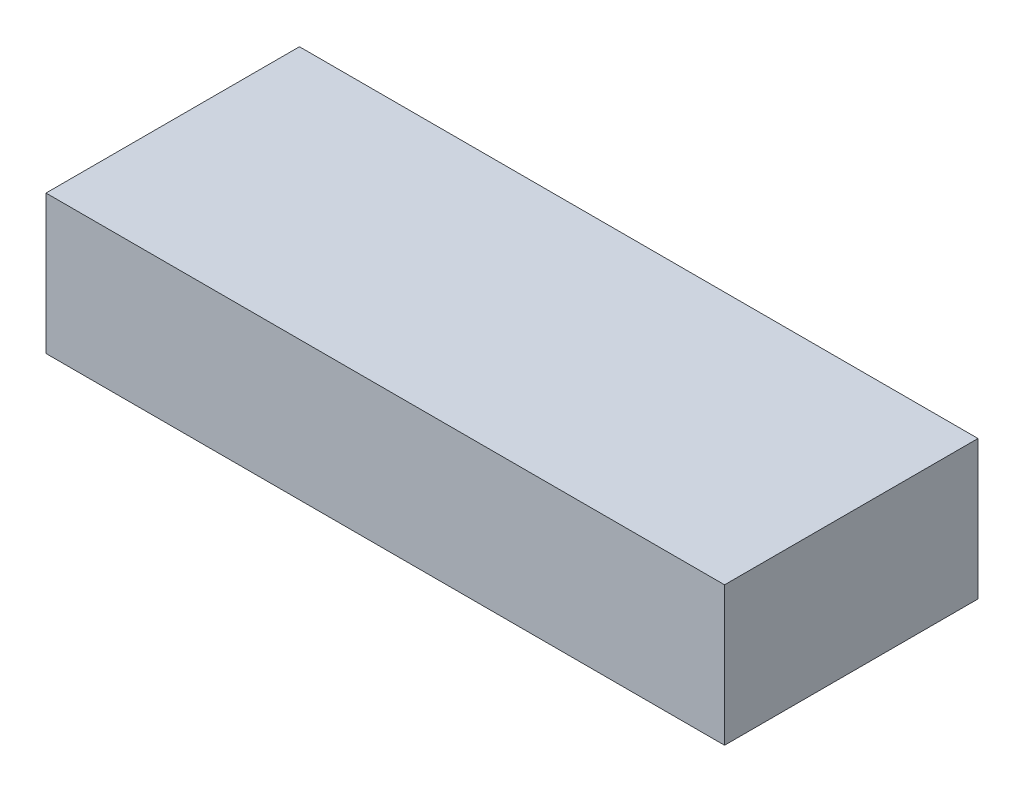
ISO-10303-21;
HEADER;
FILE_DESCRIPTION(('STEP AP214'),'2;1');
FILE_NAME('part.step','',(''),(''),'','','');
FILE_SCHEMA(('AUTOMOTIVE_DESIGN { 1 0 10303 214 1 1 1 1 }'));
ENDSEC;
DATA;
#1=APPLICATION_CONTEXT('core data for automotive mechanical design processes');
#2=APPLICATION_PROTOCOL_DEFINITION('international standard','automotive_design',2000,#1);
#3=PRODUCT_CONTEXT('',#1,'mechanical');
#4=PRODUCT('Part','Part','',(#3));
#5=PRODUCT_RELATED_PRODUCT_CATEGORY('part','',(#4));
#6=PRODUCT_DEFINITION_FORMATION('','',#4);
#7=PRODUCT_DEFINITION_CONTEXT('part definition',#1,'design');
#8=PRODUCT_DEFINITION('design','',#6,#7);
#9=PRODUCT_DEFINITION_SHAPE('','',#8);
#10=(LENGTH_UNIT() NAMED_UNIT(*) SI_UNIT(.MILLI.,.METRE.));
#11=(NAMED_UNIT(*) PLANE_ANGLE_UNIT() SI_UNIT($,.RADIAN.));
#12=(NAMED_UNIT(*) SI_UNIT($,.STERADIAN.) SOLID_ANGLE_UNIT());
#13=UNCERTAINTY_MEASURE_WITH_UNIT(LENGTH_MEASURE(1.E-05),#10,'distance_accuracy_value','');
#14=(GEOMETRIC_REPRESENTATION_CONTEXT(3) GLOBAL_UNCERTAINTY_ASSIGNED_CONTEXT((#13)) GLOBAL_UNIT_ASSIGNED_CONTEXT((#10,
#11,#12)) REPRESENTATION_CONTEXT('',''));
#15=CARTESIAN_POINT('',(0.,0.,0.));
#16=DIRECTION('',(0.,0.,1.));
#17=DIRECTION('',(1.,0.,0.));
#18=AXIS2_PLACEMENT_3D('',#15,#16,#17);
#19=CARTESIAN_POINT('',(0.,17.,31.));
#20=DIRECTION('',(1.,0.,0.));
#21=DIRECTION('',(0.,0.,-1.));
#22=AXIS2_PLACEMENT_3D('',#19,#20,#21);
#23=PLANE('',#22);
#24=DIRECTION('',(0.,-1.,0.));
#25=VECTOR('',#24,1.);
#26=CARTESIAN_POINT('',(0.,17.,0.));
#27=LINE('',#26,#25);
#28=CARTESIAN_POINT('',(0.,17.,0.));
#29=VERTEX_POINT('',#28);
#30=CARTESIAN_POINT('',(0.,0.,0.));
#31=VERTEX_POINT('',#30);
#32=EDGE_CURVE('E94',#29,#31,#27,.T.);
#33=ORIENTED_EDGE('',*,*,#32,.T.);
#34=DIRECTION('',(0.,0.,-1.));
#35=VECTOR('',#34,1.);
#36=CARTESIAN_POINT('',(0.,0.,31.));
#37=LINE('',#36,#35);
#38=CARTESIAN_POINT('',(0.,0.,31.));
#39=VERTEX_POINT('',#38);
#40=EDGE_CURVE('E11',#39,#31,#37,.T.);
#41=ORIENTED_EDGE('',*,*,#40,.F.);
#42=DIRECTION('',(0.,-1.,0.));
#43=VECTOR('',#42,1.);
#44=CARTESIAN_POINT('',(0.,17.,31.));
#45=LINE('',#44,#43);
#46=CARTESIAN_POINT('',(0.,17.,31.));
#47=VERTEX_POINT('',#46);
#48=EDGE_CURVE('E82',#47,#39,#45,.T.);
#49=ORIENTED_EDGE('',*,*,#48,.F.);
#50=DIRECTION('',(0.,0.,-1.));
#51=VECTOR('',#50,1.);
#52=CARTESIAN_POINT('',(0.,17.,31.));
#53=LINE('',#52,#51);
#54=EDGE_CURVE('E90',#47,#29,#53,.T.);
#55=ORIENTED_EDGE('',*,*,#54,.T.);
#56=EDGE_LOOP('',(#33,#41,#49,#55));
#57=FACE_BOUND('',#56,.T.);
#58=ADVANCED_FACE('F31',(#57),#23,.F.);
#59=CARTESIAN_POINT('',(0.,0.,31.));
#60=DIRECTION('',(0.,1.,0.));
#61=DIRECTION('',(0.,0.,1.));
#62=AXIS2_PLACEMENT_3D('',#59,#60,#61);
#63=PLANE('',#62);
#64=DIRECTION('',(1.,0.,0.));
#65=VECTOR('',#64,1.);
#66=CARTESIAN_POINT('',(0.,0.,0.));
#67=LINE('',#66,#65);
#68=CARTESIAN_POINT('',(83.,0.,0.));
#69=VERTEX_POINT('',#68);
#70=EDGE_CURVE('E86',#31,#69,#67,.T.);
#71=ORIENTED_EDGE('',*,*,#70,.T.);
#72=DIRECTION('',(0.,0.,-1.));
#73=VECTOR('',#72,1.);
#74=CARTESIAN_POINT('',(83.,0.,31.));
#75=LINE('',#74,#73);
#76=CARTESIAN_POINT('',(83.,0.,31.));
#77=VERTEX_POINT('',#76);
#78=EDGE_CURVE('E39',#77,#69,#75,.T.);
#79=ORIENTED_EDGE('',*,*,#78,.F.);
#80=DIRECTION('',(1.,0.,0.));
#81=VECTOR('',#80,1.);
#82=CARTESIAN_POINT('',(0.,0.,31.));
#83=LINE('',#82,#81);
#84=EDGE_CURVE('E77',#39,#77,#83,.T.);
#85=ORIENTED_EDGE('',*,*,#84,.F.);
#86=ORIENTED_EDGE('',*,*,#40,.T.);
#87=EDGE_LOOP('',(#71,#79,#85,#86));
#88=FACE_BOUND('',#87,.T.);
#89=ADVANCED_FACE('F85',(#88),#63,.F.);
#90=CARTESIAN_POINT('',(83.,0.,31.));
#91=DIRECTION('',(-1.,0.,0.));
#92=DIRECTION('',(0.,0.,1.));
#93=AXIS2_PLACEMENT_3D('',#90,#91,#92);
#94=PLANE('',#93);
#95=DIRECTION('',(0.,1.,0.));
#96=VECTOR('',#95,1.);
#97=CARTESIAN_POINT('',(83.,0.,0.));
#98=LINE('',#97,#96);
#99=CARTESIAN_POINT('',(83.,17.,0.));
#100=VERTEX_POINT('',#99);
#101=EDGE_CURVE('E64',#69,#100,#98,.T.);
#102=ORIENTED_EDGE('',*,*,#101,.T.);
#103=DIRECTION('',(0.,0.,-1.));
#104=VECTOR('',#103,1.);
#105=CARTESIAN_POINT('',(83.,17.,31.));
#106=LINE('',#105,#104);
#107=CARTESIAN_POINT('',(83.,17.,31.));
#108=VERTEX_POINT('',#107);
#109=EDGE_CURVE('E87',#108,#100,#106,.T.);
#110=ORIENTED_EDGE('',*,*,#109,.F.);
#111=DIRECTION('',(0.,1.,0.));
#112=VECTOR('',#111,1.);
#113=CARTESIAN_POINT('',(83.,0.,31.));
#114=LINE('',#113,#112);
#115=EDGE_CURVE('E80',#77,#108,#114,.T.);
#116=ORIENTED_EDGE('',*,*,#115,.F.);
#117=ORIENTED_EDGE('',*,*,#78,.T.);
#118=EDGE_LOOP('',(#102,#110,#116,#117));
#119=FACE_BOUND('',#118,.T.);
#120=ADVANCED_FACE('F88',(#119),#94,.F.);
#121=CARTESIAN_POINT('',(83.,17.,31.));
#122=DIRECTION('',(0.,-1.,0.));
#123=DIRECTION('',(0.,0.,-1.));
#124=AXIS2_PLACEMENT_3D('',#121,#122,#123);
#125=PLANE('',#124);
#126=DIRECTION('',(-1.,0.,0.));
#127=VECTOR('',#126,1.);
#128=CARTESIAN_POINT('',(83.,17.,0.));
#129=LINE('',#128,#127);
#130=EDGE_CURVE('E70',#100,#29,#129,.T.);
#131=ORIENTED_EDGE('',*,*,#130,.T.);
#132=ORIENTED_EDGE('',*,*,#54,.F.);
#133=DIRECTION('',(-1.,0.,0.));
#134=VECTOR('',#133,1.);
#135=CARTESIAN_POINT('',(83.,17.,31.));
#136=LINE('',#135,#134);
#137=EDGE_CURVE('E47',#108,#47,#136,.T.);
#138=ORIENTED_EDGE('',*,*,#137,.F.);
#139=ORIENTED_EDGE('',*,*,#109,.T.);
#140=EDGE_LOOP('',(#131,#132,#138,#139));
#141=FACE_BOUND('',#140,.T.);
#142=ADVANCED_FACE('F101',(#141),#125,.F.);
#143=CARTESIAN_POINT('',(0.,0.,31.));
#144=DIRECTION('',(0.,0.,1.));
#145=DIRECTION('',(1.,0.,0.));
#146=AXIS2_PLACEMENT_3D('',#143,#144,#145);
#147=PLANE('',#146);
#148=ORIENTED_EDGE('',*,*,#48,.T.);
#149=ORIENTED_EDGE('',*,*,#84,.T.);
#150=ORIENTED_EDGE('',*,*,#115,.T.);
#151=ORIENTED_EDGE('',*,*,#137,.T.);
#152=EDGE_LOOP('',(#148,#149,#150,#151));
#153=FACE_BOUND('',#152,.T.);
#154=ADVANCED_FACE('F78',(#153),#147,.T.);
#155=CARTESIAN_POINT('',(0.,0.,0.));
#156=DIRECTION('',(0.,0.,1.));
#157=DIRECTION('',(1.,0.,0.));
#158=AXIS2_PLACEMENT_3D('',#155,#156,#157);
#159=PLANE('',#158);
#160=ORIENTED_EDGE('',*,*,#32,.F.);
#161=ORIENTED_EDGE('',*,*,#130,.F.);
#162=ORIENTED_EDGE('',*,*,#101,.F.);
#163=ORIENTED_EDGE('',*,*,#70,.F.);
#164=EDGE_LOOP('',(#160,#161,#162,#163));
#165=FACE_BOUND('',#164,.T.);
#166=ADVANCED_FACE('F104',(#165),#159,.F.);
#167=CLOSED_SHELL('',(#58,#89,#120,#142,#154,#166));
#168=MANIFOLD_SOLID_BREP('B2',#167);
#169=ADVANCED_BREP_SHAPE_REPRESENTATION('',(#18,#168),#14);
#170=SHAPE_DEFINITION_REPRESENTATION(#9,#169);
ENDSEC;
END-ISO-10303-21;
